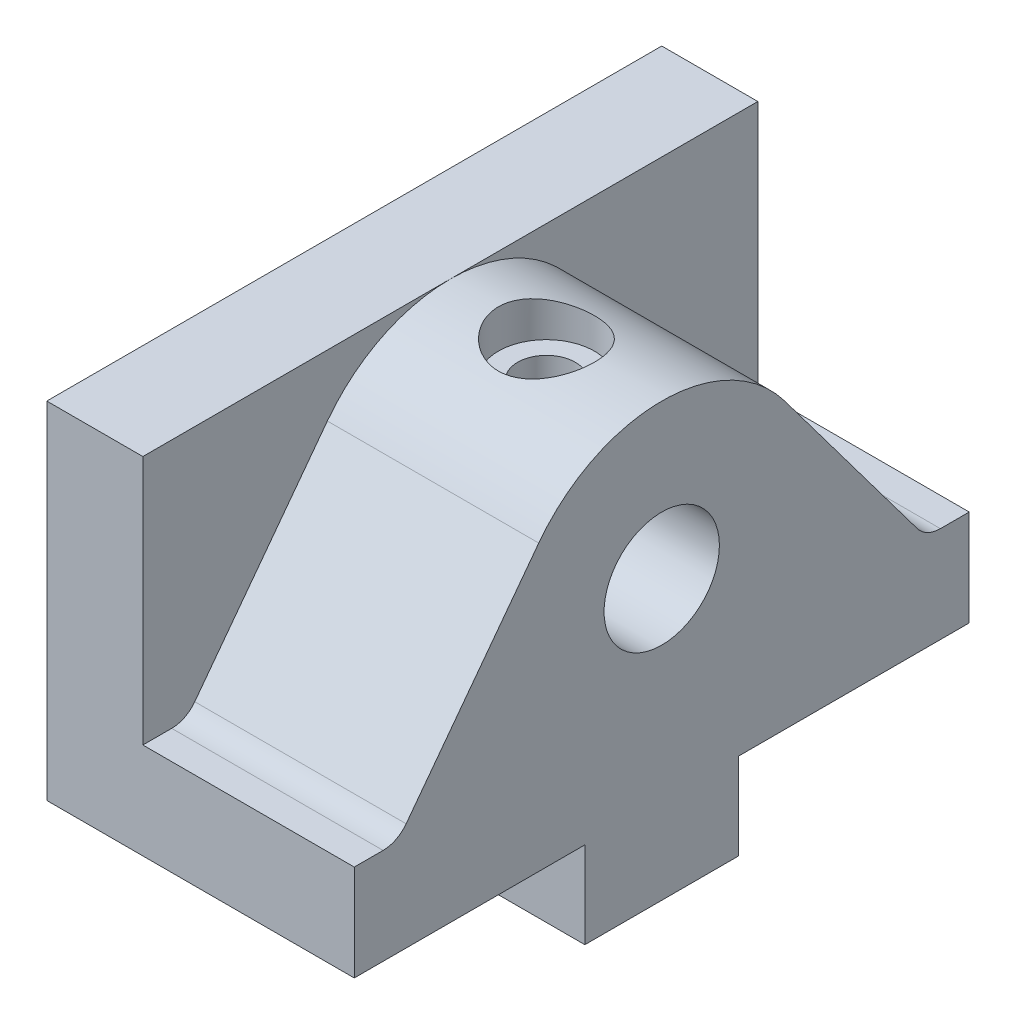
ISO-10303-21;
HEADER;
FILE_DESCRIPTION(('STEP AP214'),'2;1');
FILE_NAME('part.step','',(''),(''),'','','');
FILE_SCHEMA(('AUTOMOTIVE_DESIGN { 1 0 10303 214 1 1 1 1 }'));
ENDSEC;
DATA;
#1=APPLICATION_CONTEXT('core data for automotive mechanical design processes');
#2=APPLICATION_PROTOCOL_DEFINITION('international standard','automotive_design',2000,#1);
#3=PRODUCT_CONTEXT('',#1,'mechanical');
#4=PRODUCT('Part','Part','',(#3));
#5=PRODUCT_RELATED_PRODUCT_CATEGORY('part','',(#4));
#6=PRODUCT_DEFINITION_FORMATION('','',#4);
#7=PRODUCT_DEFINITION_CONTEXT('part definition',#1,'design');
#8=PRODUCT_DEFINITION('design','',#6,#7);
#9=PRODUCT_DEFINITION_SHAPE('','',#8);
#10=(LENGTH_UNIT() NAMED_UNIT(*) SI_UNIT(.MILLI.,.METRE.));
#11=(NAMED_UNIT(*) PLANE_ANGLE_UNIT() SI_UNIT($,.RADIAN.));
#12=(NAMED_UNIT(*) SI_UNIT($,.STERADIAN.) SOLID_ANGLE_UNIT());
#13=UNCERTAINTY_MEASURE_WITH_UNIT(LENGTH_MEASURE(1.E-05),#10,'distance_accuracy_value','');
#14=(GEOMETRIC_REPRESENTATION_CONTEXT(3) GLOBAL_UNCERTAINTY_ASSIGNED_CONTEXT((#13)) GLOBAL_UNIT_ASSIGNED_CONTEXT((#10,
#11,#12)) REPRESENTATION_CONTEXT('',''));
#15=CARTESIAN_POINT('',(0.,0.,0.));
#16=DIRECTION('',(0.,0.,1.));
#17=DIRECTION('',(1.,0.,0.));
#18=AXIS2_PLACEMENT_3D('',#15,#16,#17);
#19=CARTESIAN_POINT('',(10.,0.,0.));
#20=DIRECTION('',(-1.,0.,0.));
#21=DIRECTION('',(0.,0.,1.));
#22=AXIS2_PLACEMENT_3D('',#19,#20,#21);
#23=PLANE('',#22);
#24=DIRECTION('',(0.,-0.8,-0.600000000000001));
#25=VECTOR('',#24,1.);
#26=CARTESIAN_POINT('',(10.,20.04,-26.72));
#27=LINE('',#26,#25);
#28=CARTESIAN_POINT('',(10.,38.6,-12.8));
#29=VERTEX_POINT('',#28);
#30=CARTESIAN_POINT('',(10.,20.2,-26.6));
#31=VERTEX_POINT('',#30);
#32=EDGE_CURVE('E299',#29,#31,#27,.T.);
#33=ORIENTED_EDGE('',*,*,#32,.T.);
#34=CARTESIAN_POINT('',(10.,22.,-29.));
#35=DIRECTION('',(-1.,0.,0.));
#36=DIRECTION('',(0.,0.,1.));
#37=AXIS2_PLACEMENT_3D('',#34,#35,#36);
#38=CIRCLE('',#37,3.);
#39=CARTESIAN_POINT('',(10.,19.,-29.));
#40=VERTEX_POINT('',#39);
#41=EDGE_CURVE('E62',#31,#40,#38,.F.);
#42=ORIENTED_EDGE('',*,*,#41,.T.);
#43=DIRECTION('',(0.,0.,-1.));
#44=VECTOR('',#43,1.);
#45=CARTESIAN_POINT('',(10.,19.,0.));
#46=LINE('',#45,#44);
#47=CARTESIAN_POINT('',(10.,19.,-32.));
#48=VERTEX_POINT('',#47);
#49=EDGE_CURVE('E305',#40,#48,#46,.T.);
#50=ORIENTED_EDGE('',*,*,#49,.T.);
#51=DIRECTION('',(0.,-1.,0.));
#52=VECTOR('',#51,1.);
#53=CARTESIAN_POINT('',(10.,45.,-32.));
#54=LINE('',#53,#52);
#55=CARTESIAN_POINT('',(10.,45.,-32.));
#56=VERTEX_POINT('',#55);
#57=EDGE_CURVE('E336',#56,#48,#54,.T.);
#58=ORIENTED_EDGE('',*,*,#57,.F.);
#59=DIRECTION('',(0.,0.,-1.));
#60=VECTOR('',#59,1.);
#61=CARTESIAN_POINT('',(10.,45.,32.));
#62=LINE('',#61,#60);
#63=CARTESIAN_POINT('',(10.,45.,0.));
#64=VERTEX_POINT('',#63);
#65=EDGE_CURVE('E337',#64,#56,#62,.T.);
#66=ORIENTED_EDGE('',*,*,#65,.F.);
#67=CARTESIAN_POINT('',(10.,29.,0.));
#68=DIRECTION('',(1.,0.,0.));
#69=DIRECTION('',(0.,0.,-1.));
#70=AXIS2_PLACEMENT_3D('',#67,#68,#69);
#71=CIRCLE('',#70,16.);
#72=EDGE_CURVE('E233',#64,#29,#71,.F.);
#73=ORIENTED_EDGE('',*,*,#72,.T.);
#74=EDGE_LOOP('',(#33,#42,#50,#58,#66,#73));
#75=FACE_BOUND('',#74,.T.);
#76=ADVANCED_FACE('F39',(#75),#23,.F.);
#77=CARTESIAN_POINT('',(10.,45.,32.));
#78=DIRECTION('',(0.,1.,0.));
#79=DIRECTION('',(0.,0.,1.));
#80=AXIS2_PLACEMENT_3D('',#77,#78,#79);
#81=PLANE('',#80);
#82=DIRECTION('',(0.,0.,-1.));
#83=VECTOR('',#82,1.);
#84=CARTESIAN_POINT('',(0.,45.,32.));
#85=LINE('',#84,#83);
#86=CARTESIAN_POINT('',(0.,45.,32.));
#87=VERTEX_POINT('',#86);
#88=CARTESIAN_POINT('',(0.,45.,-32.));
#89=VERTEX_POINT('',#88);
#90=EDGE_CURVE('E331',#87,#89,#85,.T.);
#91=ORIENTED_EDGE('',*,*,#90,.F.);
#92=DIRECTION('',(-1.,0.,0.));
#93=VECTOR('',#92,1.);
#94=CARTESIAN_POINT('',(10.,45.,32.));
#95=LINE('',#94,#93);
#96=CARTESIAN_POINT('',(10.,45.,32.));
#97=VERTEX_POINT('',#96);
#98=EDGE_CURVE('E375',#97,#87,#95,.T.);
#99=ORIENTED_EDGE('',*,*,#98,.F.);
#100=EDGE_CURVE('E332',#97,#64,#62,.T.);
#101=ORIENTED_EDGE('',*,*,#100,.T.);
#102=ORIENTED_EDGE('',*,*,#65,.T.);
#103=DIRECTION('',(-1.,0.,0.));
#104=VECTOR('',#103,1.);
#105=CARTESIAN_POINT('',(10.,45.,-32.));
#106=LINE('',#105,#104);
#107=EDGE_CURVE('E234',#56,#89,#106,.T.);
#108=ORIENTED_EDGE('',*,*,#107,.T.);
#109=EDGE_LOOP('',(#91,#99,#101,#102,#108));
#110=FACE_BOUND('',#109,.T.);
#111=ADVANCED_FACE('F258',(#110),#81,.T.);
#112=CARTESIAN_POINT('',(10.,8.99999999999999,32.));
#113=DIRECTION('',(0.,0.,1.));
#114=DIRECTION('',(0.,-1.,0.));
#115=AXIS2_PLACEMENT_3D('',#112,#113,#114);
#116=PLANE('',#115);
#117=DIRECTION('',(0.,1.,0.));
#118=VECTOR('',#117,1.);
#119=CARTESIAN_POINT('',(0.,8.99999999999999,32.));
#120=LINE('',#119,#118);
#121=CARTESIAN_POINT('',(0.,8.99999999999999,32.));
#122=VERTEX_POINT('',#121);
#123=EDGE_CURVE('E371',#122,#87,#120,.T.);
#124=ORIENTED_EDGE('',*,*,#123,.F.);
#125=DIRECTION('',(-1.,0.,0.));
#126=VECTOR('',#125,1.);
#127=CARTESIAN_POINT('',(10.,8.99999999999999,32.));
#128=LINE('',#127,#126);
#129=CARTESIAN_POINT('',(32.,8.99999999999999,32.));
#130=VERTEX_POINT('',#129);
#131=EDGE_CURVE('E378',#130,#122,#128,.T.);
#132=ORIENTED_EDGE('',*,*,#131,.F.);
#133=DIRECTION('',(0.,-1.,0.));
#134=VECTOR('',#133,1.);
#135=CARTESIAN_POINT('',(32.,0.,32.));
#136=LINE('',#135,#134);
#137=CARTESIAN_POINT('',(32.,19.,32.));
#138=VERTEX_POINT('',#137);
#139=EDGE_CURVE('E449',#138,#130,#136,.T.);
#140=ORIENTED_EDGE('',*,*,#139,.F.);
#141=DIRECTION('',(-1.,0.,0.));
#142=VECTOR('',#141,1.);
#143=CARTESIAN_POINT('',(32.,19.,32.));
#144=LINE('',#143,#142);
#145=CARTESIAN_POINT('',(10.,19.,32.));
#146=VERTEX_POINT('',#145);
#147=EDGE_CURVE('E324',#138,#146,#144,.T.);
#148=ORIENTED_EDGE('',*,*,#147,.T.);
#149=DIRECTION('',(0.,1.,0.));
#150=VECTOR('',#149,1.);
#151=CARTESIAN_POINT('',(10.,8.99999999999999,32.));
#152=LINE('',#151,#150);
#153=EDGE_CURVE('E341',#146,#97,#152,.T.);
#154=ORIENTED_EDGE('',*,*,#153,.T.);
#155=ORIENTED_EDGE('',*,*,#98,.T.);
#156=EDGE_LOOP('',(#124,#132,#140,#148,#154,#155));
#157=FACE_BOUND('',#156,.T.);
#158=ADVANCED_FACE('F254',(#157),#116,.T.);
#159=CARTESIAN_POINT('',(10.,9.,8.));
#160=DIRECTION('',(0.,-1.,0.));
#161=DIRECTION('',(0.,0.,-1.));
#162=AXIS2_PLACEMENT_3D('',#159,#160,#161);
#163=PLANE('',#162);
#164=DIRECTION('',(0.,0.,1.));
#165=VECTOR('',#164,1.);
#166=CARTESIAN_POINT('',(0.,9.,8.));
#167=LINE('',#166,#165);
#168=CARTESIAN_POINT('',(0.,9.,8.));
#169=VERTEX_POINT('',#168);
#170=EDGE_CURVE('E367',#169,#122,#167,.T.);
#171=ORIENTED_EDGE('',*,*,#170,.F.);
#172=DIRECTION('',(-1.,0.,0.));
#173=VECTOR('',#172,1.);
#174=CARTESIAN_POINT('',(10.,9.,8.));
#175=LINE('',#174,#173);
#176=CARTESIAN_POINT('',(32.,9.,8.));
#177=VERTEX_POINT('',#176);
#178=EDGE_CURVE('E381',#177,#169,#175,.T.);
#179=ORIENTED_EDGE('',*,*,#178,.F.);
#180=DIRECTION('',(0.,0.,-1.));
#181=VECTOR('',#180,1.);
#182=CARTESIAN_POINT('',(32.,9.,0.));
#183=LINE('',#182,#181);
#184=EDGE_CURVE('E445',#130,#177,#183,.T.);
#185=ORIENTED_EDGE('',*,*,#184,.F.);
#186=ORIENTED_EDGE('',*,*,#131,.T.);
#187=EDGE_LOOP('',(#171,#179,#185,#186));
#188=FACE_BOUND('',#187,.T.);
#189=ADVANCED_FACE('F257',(#188),#163,.T.);
#190=CARTESIAN_POINT('',(10.,0.,8.));
#191=DIRECTION('',(0.,0.,1.));
#192=DIRECTION('',(0.,-1.,0.));
#193=AXIS2_PLACEMENT_3D('',#190,#191,#192);
#194=PLANE('',#193);
#195=DIRECTION('',(0.,1.,0.));
#196=VECTOR('',#195,1.);
#197=CARTESIAN_POINT('',(0.,0.,8.));
#198=LINE('',#197,#196);
#199=CARTESIAN_POINT('',(0.,0.,8.));
#200=VERTEX_POINT('',#199);
#201=EDGE_CURVE('E363',#200,#169,#198,.T.);
#202=ORIENTED_EDGE('',*,*,#201,.F.);
#203=DIRECTION('',(-1.,0.,0.));
#204=VECTOR('',#203,1.);
#205=CARTESIAN_POINT('',(10.,0.,8.));
#206=LINE('',#205,#204);
#207=CARTESIAN_POINT('',(32.,0.,8.));
#208=VERTEX_POINT('',#207);
#209=EDGE_CURVE('E384',#208,#200,#206,.T.);
#210=ORIENTED_EDGE('',*,*,#209,.F.);
#211=DIRECTION('',(0.,-1.,0.));
#212=VECTOR('',#211,1.);
#213=CARTESIAN_POINT('',(32.,0.,8.));
#214=LINE('',#213,#212);
#215=EDGE_CURVE('E441',#177,#208,#214,.T.);
#216=ORIENTED_EDGE('',*,*,#215,.F.);
#217=ORIENTED_EDGE('',*,*,#178,.T.);
#218=EDGE_LOOP('',(#202,#210,#216,#217));
#219=FACE_BOUND('',#218,.T.);
#220=ADVANCED_FACE('F262',(#219),#194,.T.);
#221=CARTESIAN_POINT('',(10.,0.,-8.));
#222=DIRECTION('',(0.,-1.,0.));
#223=DIRECTION('',(0.,0.,-1.));
#224=AXIS2_PLACEMENT_3D('',#221,#222,#223);
#225=PLANE('',#224);
#226=CARTESIAN_POINT('',(8.,0.,0.));
#227=DIRECTION('',(0.,-1.,0.));
#228=DIRECTION('',(0.,0.,-1.));
#229=AXIS2_PLACEMENT_3D('',#226,#227,#228);
#230=CIRCLE('',#229,1.15);
#231=CARTESIAN_POINT('',(8.,0.,-1.15));
#232=VERTEX_POINT('',#231);
#233=EDGE_CURVE('E170',#232,#232,#230,.T.);
#234=ORIENTED_EDGE('',*,*,#233,.F.);
#235=EDGE_LOOP('',(#234));
#236=FACE_BOUND('',#235,.T.);
#237=CARTESIAN_POINT('',(24.,0.,0.));
#238=DIRECTION('',(0.,-1.,0.));
#239=DIRECTION('',(0.,0.,-1.));
#240=AXIS2_PLACEMENT_3D('',#237,#238,#239);
#241=CIRCLE('',#240,1.15);
#242=CARTESIAN_POINT('',(24.,0.,-1.15));
#243=VERTEX_POINT('',#242);
#244=EDGE_CURVE('E169',#243,#243,#241,.T.);
#245=ORIENTED_EDGE('',*,*,#244,.F.);
#246=EDGE_LOOP('',(#245));
#247=FACE_BOUND('',#246,.T.);
#248=DIRECTION('',(0.,0.,1.));
#249=VECTOR('',#248,1.);
#250=CARTESIAN_POINT('',(0.,0.,-8.));
#251=LINE('',#250,#249);
#252=CARTESIAN_POINT('',(0.,0.,-8.));
#253=VERTEX_POINT('',#252);
#254=EDGE_CURVE('E359',#253,#200,#251,.T.);
#255=ORIENTED_EDGE('',*,*,#254,.F.);
#256=DIRECTION('',(-1.,0.,0.));
#257=VECTOR('',#256,1.);
#258=CARTESIAN_POINT('',(10.,0.,-8.));
#259=LINE('',#258,#257);
#260=CARTESIAN_POINT('',(32.,0.,-8.));
#261=VERTEX_POINT('',#260);
#262=EDGE_CURVE('E387',#261,#253,#259,.T.);
#263=ORIENTED_EDGE('',*,*,#262,.F.);
#264=DIRECTION('',(0.,0.,-1.));
#265=VECTOR('',#264,1.);
#266=CARTESIAN_POINT('',(32.,0.,0.));
#267=LINE('',#266,#265);
#268=EDGE_CURVE('E437',#208,#261,#267,.T.);
#269=ORIENTED_EDGE('',*,*,#268,.F.);
#270=ORIENTED_EDGE('',*,*,#209,.T.);
#271=EDGE_LOOP('',(#255,#263,#269,#270));
#272=FACE_BOUND('',#271,.T.);
#273=ADVANCED_FACE('F266',(#236,#247,#272),#225,.T.);
#274=CARTESIAN_POINT('',(10.,9.,-8.));
#275=DIRECTION('',(0.,0.,-1.));
#276=DIRECTION('',(0.,1.,0.));
#277=AXIS2_PLACEMENT_3D('',#274,#275,#276);
#278=PLANE('',#277);
#279=DIRECTION('',(0.,-1.,0.));
#280=VECTOR('',#279,1.);
#281=CARTESIAN_POINT('',(0.,9.,-8.));
#282=LINE('',#281,#280);
#283=CARTESIAN_POINT('',(0.,9.,-8.));
#284=VERTEX_POINT('',#283);
#285=EDGE_CURVE('E355',#284,#253,#282,.T.);
#286=ORIENTED_EDGE('',*,*,#285,.F.);
#287=DIRECTION('',(-1.,0.,0.));
#288=VECTOR('',#287,1.);
#289=CARTESIAN_POINT('',(10.,9.,-8.));
#290=LINE('',#289,#288);
#291=CARTESIAN_POINT('',(32.,9.,-8.));
#292=VERTEX_POINT('',#291);
#293=EDGE_CURVE('E390',#292,#284,#290,.T.);
#294=ORIENTED_EDGE('',*,*,#293,.F.);
#295=DIRECTION('',(0.,1.,0.));
#296=VECTOR('',#295,1.);
#297=CARTESIAN_POINT('',(32.,0.,-8.));
#298=LINE('',#297,#296);
#299=EDGE_CURVE('E433',#261,#292,#298,.T.);
#300=ORIENTED_EDGE('',*,*,#299,.F.);
#301=ORIENTED_EDGE('',*,*,#262,.T.);
#302=EDGE_LOOP('',(#286,#294,#300,#301));
#303=FACE_BOUND('',#302,.T.);
#304=ADVANCED_FACE('F270',(#303),#278,.T.);
#305=CARTESIAN_POINT('',(10.,8.99999999999999,-32.));
#306=DIRECTION('',(0.,-1.,0.));
#307=DIRECTION('',(0.,0.,-1.));
#308=AXIS2_PLACEMENT_3D('',#305,#306,#307);
#309=PLANE('',#308);
#310=DIRECTION('',(0.,0.,1.));
#311=VECTOR('',#310,1.);
#312=CARTESIAN_POINT('',(0.,8.99999999999999,-32.));
#313=LINE('',#312,#311);
#314=CARTESIAN_POINT('',(0.,8.99999999999999,-32.));
#315=VERTEX_POINT('',#314);
#316=EDGE_CURVE('E351',#315,#284,#313,.T.);
#317=ORIENTED_EDGE('',*,*,#316,.F.);
#318=DIRECTION('',(-1.,0.,0.));
#319=VECTOR('',#318,1.);
#320=CARTESIAN_POINT('',(10.,8.99999999999999,-32.));
#321=LINE('',#320,#319);
#322=CARTESIAN_POINT('',(32.,8.99999999999999,-32.));
#323=VERTEX_POINT('',#322);
#324=EDGE_CURVE('E392',#323,#315,#321,.T.);
#325=ORIENTED_EDGE('',*,*,#324,.F.);
#326=DIRECTION('',(0.,0.,-1.));
#327=VECTOR('',#326,1.);
#328=CARTESIAN_POINT('',(32.,9.,0.));
#329=LINE('',#328,#327);
#330=EDGE_CURVE('E429',#292,#323,#329,.T.);
#331=ORIENTED_EDGE('',*,*,#330,.F.);
#332=ORIENTED_EDGE('',*,*,#293,.T.);
#333=EDGE_LOOP('',(#317,#325,#331,#332));
#334=FACE_BOUND('',#333,.T.);
#335=ADVANCED_FACE('F274',(#334),#309,.T.);
#336=CARTESIAN_POINT('',(10.,45.,-32.));
#337=DIRECTION('',(0.,0.,-1.));
#338=DIRECTION('',(0.,1.,0.));
#339=AXIS2_PLACEMENT_3D('',#336,#337,#338);
#340=PLANE('',#339);
#341=DIRECTION('',(0.,-1.,0.));
#342=VECTOR('',#341,1.);
#343=CARTESIAN_POINT('',(0.,45.,-32.));
#344=LINE('',#343,#342);
#345=EDGE_CURVE('E347',#89,#315,#344,.T.);
#346=ORIENTED_EDGE('',*,*,#345,.F.);
#347=ORIENTED_EDGE('',*,*,#107,.F.);
#348=ORIENTED_EDGE('',*,*,#57,.T.);
#349=DIRECTION('',(-1.,0.,0.));
#350=VECTOR('',#349,1.);
#351=CARTESIAN_POINT('',(32.,19.,-32.));
#352=LINE('',#351,#350);
#353=CARTESIAN_POINT('',(32.,19.,-32.));
#354=VERTEX_POINT('',#353);
#355=EDGE_CURVE('E319',#354,#48,#352,.T.);
#356=ORIENTED_EDGE('',*,*,#355,.F.);
#357=DIRECTION('',(0.,1.,0.));
#358=VECTOR('',#357,1.);
#359=CARTESIAN_POINT('',(32.,0.,-32.));
#360=LINE('',#359,#358);
#361=EDGE_CURVE('E425',#323,#354,#360,.T.);
#362=ORIENTED_EDGE('',*,*,#361,.F.);
#363=ORIENTED_EDGE('',*,*,#324,.T.);
#364=EDGE_LOOP('',(#346,#347,#348,#356,#362,#363));
#365=FACE_BOUND('',#364,.T.);
#366=ADVANCED_FACE('F249',(#365),#340,.T.);
#367=DIRECTION('',(0.,0.,-1.));
#368=VECTOR('',#367,1.);
#369=CARTESIAN_POINT('',(10.,19.,0.));
#370=LINE('',#369,#368);
#371=CARTESIAN_POINT('',(10.,19.,29.));
#372=VERTEX_POINT('',#371);
#373=EDGE_CURVE('E312',#146,#372,#370,.T.);
#374=ORIENTED_EDGE('',*,*,#373,.T.);
#375=CARTESIAN_POINT('',(10.,22.,29.));
#376=DIRECTION('',(-1.,0.,0.));
#377=DIRECTION('',(0.,0.,1.));
#378=AXIS2_PLACEMENT_3D('',#375,#376,#377);
#379=CIRCLE('',#378,3.);
#380=CARTESIAN_POINT('',(10.,20.2,26.6));
#381=VERTEX_POINT('',#380);
#382=EDGE_CURVE('E464',#372,#381,#379,.F.);
#383=ORIENTED_EDGE('',*,*,#382,.T.);
#384=DIRECTION('',(0.,0.8,-0.600000000000001));
#385=VECTOR('',#384,1.);
#386=CARTESIAN_POINT('',(10.,20.04,26.72));
#387=LINE('',#386,#385);
#388=CARTESIAN_POINT('',(10.,38.6,12.8));
#389=VERTEX_POINT('',#388);
#390=EDGE_CURVE('E413',#381,#389,#387,.T.);
#391=ORIENTED_EDGE('',*,*,#390,.T.);
#392=EDGE_CURVE('E411',#389,#64,#71,.F.);
#393=ORIENTED_EDGE('',*,*,#392,.T.);
#394=ORIENTED_EDGE('',*,*,#100,.F.);
#395=ORIENTED_EDGE('',*,*,#153,.F.);
#396=EDGE_LOOP('',(#374,#383,#391,#393,#394,#395));
#397=FACE_BOUND('',#396,.T.);
#398=ADVANCED_FACE('F246',(#397),#23,.F.);
#399=CARTESIAN_POINT('',(0.,0.,0.));
#400=DIRECTION('',(-1.,0.,0.));
#401=DIRECTION('',(0.,0.,1.));
#402=AXIS2_PLACEMENT_3D('',#399,#400,#401);
#403=PLANE('',#402);
#404=ORIENTED_EDGE('',*,*,#90,.T.);
#405=ORIENTED_EDGE('',*,*,#345,.T.);
#406=ORIENTED_EDGE('',*,*,#316,.T.);
#407=ORIENTED_EDGE('',*,*,#285,.T.);
#408=ORIENTED_EDGE('',*,*,#254,.T.);
#409=ORIENTED_EDGE('',*,*,#201,.T.);
#410=ORIENTED_EDGE('',*,*,#170,.T.);
#411=ORIENTED_EDGE('',*,*,#123,.T.);
#412=EDGE_LOOP('',(#404,#405,#406,#407,#408,#409,#410,#411));
#413=FACE_BOUND('',#412,.T.);
#414=ADVANCED_FACE('F243',(#413),#403,.T.);
#415=CARTESIAN_POINT('',(32.,29.,0.));
#416=DIRECTION('',(-1.,0.,0.));
#417=DIRECTION('',(0.,0.,1.));
#418=AXIS2_PLACEMENT_3D('',#415,#416,#417);
#419=CYLINDRICAL_SURFACE('',#418,16.);
#420=CARTESIAN_POINT('',(20.,44.1986841535707,5.));
#421=CARTESIAN_POINT('',(20.2733881444516,44.1986858388479,4.99999815120853));
#422=CARTESIAN_POINT('',(20.5467950748166,44.206141260301,4.97750155166156));
#423=CARTESIAN_POINT('',(21.0855766435074,44.2350255598558,4.88836701605129));
#424=CARTESIAN_POINT('',(21.3509490909276,44.2564582140988,4.82171715130012));
#425=CARTESIAN_POINT('',(21.865779607729,44.3106375534649,4.64679152894283));
#426=CARTESIAN_POINT('',(22.115264932423,44.3433642077798,4.5385894294672));
#427=CARTESIAN_POINT('',(22.5926107834558,44.4164162487404,4.28387656692615));
#428=CARTESIAN_POINT('',(22.8204674798404,44.4567429774317,4.13735903622524));
#429=CARTESIAN_POINT('',(23.255915469974,44.5420051067468,3.80478428248921));
#430=CARTESIAN_POINT('',(23.462654437744,44.5870449353917,3.6176375988816));
#431=CARTESIAN_POINT('',(23.8423840528367,44.6757698344129,3.21144818582197));
#432=CARTESIAN_POINT('',(24.0153699877794,44.7194547149049,2.99240101007426));
#433=CARTESIAN_POINT('',(24.326444252045,44.8017421356033,2.52250364997345));
#434=CARTESIAN_POINT('',(24.4636548153258,44.8402073825112,2.27104622608038));
#435=CARTESIAN_POINT('',(24.6935041994222,44.9065020733207,1.74721693141361));
#436=CARTESIAN_POINT('',(24.7861534965983,44.9343340167968,1.47484999394821));
#437=CARTESIAN_POINT('',(24.9214045123883,44.9754870328345,0.925857427864395));
#438=CARTESIAN_POINT('',(24.9654629991514,44.9892295593656,0.649622861872867));
#439=CARTESIAN_POINT('',(25.0068973857501,45.0021438350406,0.0933632559380805));
#440=CARTESIAN_POINT('',(25.0042838974353,45.0013188964028,-0.186660907892343));
#441=CARTESIAN_POINT('',(24.9534068336562,44.9854846453012,-0.732297921418923));
#442=CARTESIAN_POINT('',(24.906722465948,44.9709660388855,-0.998074537256128));
#443=CARTESIAN_POINT('',(24.7716200398279,44.929979302435,-1.51781225339112));
#444=CARTESIAN_POINT('',(24.6831992596535,44.9035103930884,-1.77177258192494));
#445=CARTESIAN_POINT('',(24.4661192437008,44.8409383891782,-2.26431241261896));
#446=CARTESIAN_POINT('',(24.336980765749,44.8047213446668,-2.50266562249071));
#447=CARTESIAN_POINT('',(24.0425156011806,44.7264689181539,-2.95481004460872));
#448=CARTESIAN_POINT('',(23.8771797634445,44.6844320658262,-3.16859502483763));
#449=CARTESIAN_POINT('',(23.5069054607991,44.5969468293413,-3.57495079381313));
#450=CARTESIAN_POINT('',(23.3006037246516,44.5514292793937,-3.76626619636764));
#451=CARTESIAN_POINT('',(22.8584195926857,44.4636246177862,-4.11195897039057));
#452=CARTESIAN_POINT('',(22.6225337176386,44.4213378870279,-4.26633199104754));
#453=CARTESIAN_POINT('',(22.1243301246097,44.3444338653158,-4.53521860076337));
#454=CARTESIAN_POINT('',(21.8617463640361,44.3099076117639,-4.64926722799054));
#455=CARTESIAN_POINT('',(21.319762032632,44.253501811154,-4.83113383782182));
#456=CARTESIAN_POINT('',(21.0403675432225,44.2316177207004,-4.89896843060006));
#457=CARTESIAN_POINT('',(20.4847201896914,44.2039825362816,-4.98405940745619));
#458=CARTESIAN_POINT('',(20.2087920150595,44.1976186557502,-5.00323817415588));
#459=CARTESIAN_POINT('',(19.6576410340194,44.200043098397,-4.99586977992483));
#460=CARTESIAN_POINT('',(19.3824181252013,44.2088290802926,-4.96932968445626));
#461=CARTESIAN_POINT('',(18.8487668133903,44.2399582993566,-4.87299494052764));
#462=CARTESIAN_POINT('',(18.5900829037032,44.2619021640804,-4.80447324642202));
#463=CARTESIAN_POINT('',(18.0879128320167,44.3164514932552,-4.62761494644059));
#464=CARTESIAN_POINT('',(17.8444291563155,44.3490586964925,-4.51927184684604));
#465=CARTESIAN_POINT('',(17.3718435609128,44.4224215861294,-4.26230042623513));
#466=CARTESIAN_POINT('',(17.1433543376288,44.4633841395902,-4.11260589954233));
#467=CARTESIAN_POINT('',(16.7140386145524,44.5484139589123,-3.77842563471921));
#468=CARTESIAN_POINT('',(16.5132193242987,44.5924820294279,-3.59393085876312));
#469=CARTESIAN_POINT('',(16.1363585363487,44.6809675025074,-3.18629179101443));
#470=CARTESIAN_POINT('',(15.9616888554405,44.7253236914272,-2.96186259915409));
#471=CARTESIAN_POINT('',(15.652435826715,44.8075623937471,-2.48580618260559));
#472=CARTESIAN_POINT('',(15.5178506427559,44.8454452036378,-2.23418020443449));
#473=CARTESIAN_POINT('',(15.2938777501133,44.9102524771405,-1.71242209332733));
#474=CARTESIAN_POINT('',(15.2041628486253,44.937255982448,-1.44244073713503));
#475=CARTESIAN_POINT('',(15.0717098456412,44.9776097059431,-0.890229016225558));
#476=CARTESIAN_POINT('',(15.028957043666,44.9909641965712,-0.608002513361419));
#477=CARTESIAN_POINT('',(14.9928359930015,45.0022321361783,-0.0519397465956098));
#478=CARTESIAN_POINT('',(14.9974861993169,45.0007651762951,0.221756767786048));
#479=CARTESIAN_POINT('',(15.0512472441948,44.9840391232424,0.764292887693025));
#480=CARTESIAN_POINT('',(15.100355183968,44.9687809293064,1.0331328087184));
#481=CARTESIAN_POINT('',(15.2403760368889,44.9263828337901,1.55502047392302));
#482=CARTESIAN_POINT('',(15.3307584313808,44.899393918402,1.80822367379742));
#483=CARTESIAN_POINT('',(15.5502833088346,44.8363178235242,2.29599370200086));
#484=CARTESIAN_POINT('',(15.6794324398962,44.8002290836774,2.53055732509979));
#485=CARTESIAN_POINT('',(15.9778910333752,44.7211958753111,2.98304677987682));
#486=CARTESIAN_POINT('',(16.148414089846,44.6780603899479,3.20013842820512));
#487=CARTESIAN_POINT('',(16.5226395577837,44.590349461973,3.60328316560459));
#488=CARTESIAN_POINT('',(16.7263518965944,44.5457735917315,3.78932693404398));
#489=CARTESIAN_POINT('',(17.1692628793298,44.4584757027472,4.13131463642454));
#490=CARTESIAN_POINT('',(17.4094136123294,44.4158640332118,4.28605711968616));
#491=CARTESIAN_POINT('',(17.9135924809501,44.3392050100618,4.55281882984169));
#492=CARTESIAN_POINT('',(18.1776109057873,44.3051541945183,4.66485533612217));
#493=CARTESIAN_POINT('',(18.6988904692749,44.2522624175552,4.83484721745085));
#494=CARTESIAN_POINT('',(18.9548101897559,44.2323726005923,4.89659759350261));
#495=CARTESIAN_POINT('',(19.4738153283157,44.2055842579893,4.97916983261894));
#496=CARTESIAN_POINT('',(19.7368989647822,44.1986825317074,5.00000177922473));
#497=CARTESIAN_POINT('',(20.,44.1986841535707,5.));
#498=B_SPLINE_CURVE_WITH_KNOTS('',3,(#420,#421,#422,#423,#424,#425,#426,#427,#428,#429,#430,
#431,#432,#433,#434,#435,#436,#437,#438,#439,#440,#441,#442,#443,#444,#445,#446,#447,#448,#449,
#450,#451,#452,#453,#454,#455,#456,#457,#458,#459,#460,#461,#462,#463,#464,#465,#466,#467,#468,
#469,#470,#471,#472,#473,#474,#475,#476,#477,#478,#479,#480,#481,#482,#483,#484,#485,#486,#487,
#488,#489,#490,#491,#492,#493,#494,#495,#496,#497),.UNSPECIFIED.,.T.,.F.,(4,2,2,2,2,2,2,2,2,2,2,
2,2,2,2,2,2,2,2,2,2,2,2,2,2,2,2,2,2,2,2,2,2,2,2,2,2,2,4),(0.,0.819192550193962,1.63860650823894,
2.45657457647432,3.27468721969978,4.11828322203352,4.9619969176449,5.82479287854932,
6.68738589671687,7.52334891342134,8.35912185887097,9.16603931879001,9.97300940760372,
10.7898561843363,11.6069097085275,12.4580135574933,13.309217594151,14.1699388374229,
15.0303505582074,15.8561973316147,16.6819164888608,17.4837588818718,18.2857320902257,
19.1107045324817,19.9358915205725,20.7952775125577,21.6546241327807,22.5076095717372,
23.3603279257207,24.1775520976783,24.9947229877895,25.8016738606876,26.6087631965633,
27.4432277243059,28.2779423109849,29.1403118201788,30.002332032282,30.7908941750129,
31.5792619677388),.UNSPECIFIED.);
#499=CARTESIAN_POINT('',(20.,44.1986841535707,5.));
#500=VERTEX_POINT('',#499);
#501=EDGE_CURVE('E223',#500,#500,#498,.T.);
#502=ORIENTED_EDGE('',*,*,#501,.F.);
#503=EDGE_LOOP('',(#502));
#504=FACE_BOUND('',#503,.T.);
#505=ORIENTED_EDGE('',*,*,#392,.F.);
#506=DIRECTION('',(-1.,0.,0.));
#507=VECTOR('',#506,1.);
#508=CARTESIAN_POINT('',(32.,38.6,12.8));
#509=LINE('',#508,#507);
#510=CARTESIAN_POINT('',(32.,38.6,12.8));
#511=VERTEX_POINT('',#510);
#512=EDGE_CURVE('E327',#511,#389,#509,.T.);
#513=ORIENTED_EDGE('',*,*,#512,.F.);
#514=CARTESIAN_POINT('',(32.,29.,0.));
#515=DIRECTION('',(1.,0.,0.));
#516=DIRECTION('',(0.,0.,-1.));
#517=AXIS2_PLACEMENT_3D('',#514,#515,#516);
#518=CIRCLE('',#517,16.);
#519=CARTESIAN_POINT('',(32.,38.6,-12.8));
#520=VERTEX_POINT('',#519);
#521=EDGE_CURVE('E304',#511,#520,#518,.F.);
#522=ORIENTED_EDGE('',*,*,#521,.T.);
#523=DIRECTION('',(-1.,0.,0.));
#524=VECTOR('',#523,1.);
#525=CARTESIAN_POINT('',(32.,38.6,-12.8));
#526=LINE('',#525,#524);
#527=EDGE_CURVE('E316',#520,#29,#526,.T.);
#528=ORIENTED_EDGE('',*,*,#527,.T.);
#529=ORIENTED_EDGE('',*,*,#72,.F.);
#530=EDGE_LOOP('',(#505,#513,#522,#528,#529));
#531=FACE_BOUND('',#530,.T.);
#532=ADVANCED_FACE('F237',(#504,#531),#419,.T.);
#533=CARTESIAN_POINT('',(32.,20.04,26.72));
#534=DIRECTION('',(0.,0.6,0.8));
#535=DIRECTION('',(0.,-0.8,0.6));
#536=AXIS2_PLACEMENT_3D('',#533,#534,#535);
#537=PLANE('',#536);
#538=ORIENTED_EDGE('',*,*,#390,.F.);
#539=DIRECTION('',(-1.,0.,0.));
#540=VECTOR('',#539,1.);
#541=CARTESIAN_POINT('',(32.,20.2,26.6));
#542=LINE('',#541,#540);
#543=CARTESIAN_POINT('',(32.,20.2,26.6));
#544=VERTEX_POINT('',#543);
#545=EDGE_CURVE('E472',#381,#544,#542,.F.);
#546=ORIENTED_EDGE('',*,*,#545,.T.);
#547=DIRECTION('',(0.,0.8,-0.600000000000001));
#548=VECTOR('',#547,1.);
#549=CARTESIAN_POINT('',(32.,20.04,26.72));
#550=LINE('',#549,#548);
#551=EDGE_CURVE('E310',#544,#511,#550,.T.);
#552=ORIENTED_EDGE('',*,*,#551,.T.);
#553=ORIENTED_EDGE('',*,*,#512,.T.);
#554=EDGE_LOOP('',(#538,#546,#552,#553));
#555=FACE_BOUND('',#554,.T.);
#556=ADVANCED_FACE('F242',(#555),#537,.T.);
#557=CARTESIAN_POINT('',(32.,19.,0.));
#558=DIRECTION('',(0.,1.,0.));
#559=DIRECTION('',(0.,0.,1.));
#560=AXIS2_PLACEMENT_3D('',#557,#558,#559);
#561=PLANE('',#560);
#562=DIRECTION('',(0.,0.,-1.));
#563=VECTOR('',#562,1.);
#564=CARTESIAN_POINT('',(32.,19.,0.));
#565=LINE('',#564,#563);
#566=CARTESIAN_POINT('',(32.,19.,29.));
#567=VERTEX_POINT('',#566);
#568=EDGE_CURVE('E452',#138,#567,#565,.T.);
#569=ORIENTED_EDGE('',*,*,#568,.T.);
#570=DIRECTION('',(-1.,0.,0.));
#571=VECTOR('',#570,1.);
#572=CARTESIAN_POINT('',(10.,19.,29.));
#573=LINE('',#572,#571);
#574=EDGE_CURVE('E232',#567,#372,#573,.T.);
#575=ORIENTED_EDGE('',*,*,#574,.T.);
#576=ORIENTED_EDGE('',*,*,#373,.F.);
#577=ORIENTED_EDGE('',*,*,#147,.F.);
#578=EDGE_LOOP('',(#569,#575,#576,#577));
#579=FACE_BOUND('',#578,.T.);
#580=ADVANCED_FACE('F467',(#579),#561,.T.);
#581=CARTESIAN_POINT('',(32.,19.,0.));
#582=DIRECTION('',(0.,1.,0.));
#583=DIRECTION('',(0.,0.,1.));
#584=AXIS2_PLACEMENT_3D('',#581,#582,#583);
#585=PLANE('',#584);
#586=ORIENTED_EDGE('',*,*,#49,.F.);
#587=DIRECTION('',(-1.,0.,0.));
#588=VECTOR('',#587,1.);
#589=CARTESIAN_POINT('',(32.,19.,-29.));
#590=LINE('',#589,#588);
#591=CARTESIAN_POINT('',(32.,19.,-29.));
#592=VERTEX_POINT('',#591);
#593=EDGE_CURVE('E48',#40,#592,#590,.F.);
#594=ORIENTED_EDGE('',*,*,#593,.T.);
#595=DIRECTION('',(0.,0.,-1.));
#596=VECTOR('',#595,1.);
#597=CARTESIAN_POINT('',(32.,19.,0.));
#598=LINE('',#597,#596);
#599=EDGE_CURVE('E422',#592,#354,#598,.T.);
#600=ORIENTED_EDGE('',*,*,#599,.T.);
#601=ORIENTED_EDGE('',*,*,#355,.T.);
#602=EDGE_LOOP('',(#586,#594,#600,#601));
#603=FACE_BOUND('',#602,.T.);
#604=ADVANCED_FACE('F492',(#603),#585,.T.);
#605=CARTESIAN_POINT('',(32.,20.04,-26.72));
#606=DIRECTION('',(0.,0.6,-0.8));
#607=DIRECTION('',(0.,0.8,0.6));
#608=AXIS2_PLACEMENT_3D('',#605,#606,#607);
#609=PLANE('',#608);
#610=DIRECTION('',(0.,-0.8,-0.600000000000001));
#611=VECTOR('',#610,1.);
#612=CARTESIAN_POINT('',(32.,20.04,-26.72));
#613=LINE('',#612,#611);
#614=CARTESIAN_POINT('',(32.,20.2,-26.6));
#615=VERTEX_POINT('',#614);
#616=EDGE_CURVE('E320',#520,#615,#613,.T.);
#617=ORIENTED_EDGE('',*,*,#616,.T.);
#618=DIRECTION('',(-1.,0.,0.));
#619=VECTOR('',#618,1.);
#620=CARTESIAN_POINT('',(10.,20.2,-26.6));
#621=LINE('',#620,#619);
#622=EDGE_CURVE('E479',#615,#31,#621,.T.);
#623=ORIENTED_EDGE('',*,*,#622,.T.);
#624=ORIENTED_EDGE('',*,*,#32,.F.);
#625=ORIENTED_EDGE('',*,*,#527,.F.);
#626=EDGE_LOOP('',(#617,#623,#624,#625));
#627=FACE_BOUND('',#626,.T.);
#628=ADVANCED_FACE('F485',(#627),#609,.T.);
#629=CARTESIAN_POINT('',(32.,0.,0.));
#630=DIRECTION('',(1.,0.,0.));
#631=DIRECTION('',(0.,0.,-1.));
#632=AXIS2_PLACEMENT_3D('',#629,#630,#631);
#633=PLANE('',#632);
#634=CARTESIAN_POINT('',(32.,29.,0.));
#635=DIRECTION('',(1.,0.,0.));
#636=DIRECTION('',(0.,0.,-1.));
#637=AXIS2_PLACEMENT_3D('',#634,#635,#636);
#638=CIRCLE('',#637,6.);
#639=CARTESIAN_POINT('',(32.,29.,-6.));
#640=VERTEX_POINT('',#639);
#641=EDGE_CURVE('E200',#640,#640,#638,.T.);
#642=ORIENTED_EDGE('',*,*,#641,.F.);
#643=EDGE_LOOP('',(#642));
#644=FACE_BOUND('',#643,.T.);
#645=ORIENTED_EDGE('',*,*,#521,.F.);
#646=ORIENTED_EDGE('',*,*,#551,.F.);
#647=CARTESIAN_POINT('',(32.,22.,29.));
#648=DIRECTION('',(1.,0.,0.));
#649=DIRECTION('',(0.,0.,-1.));
#650=AXIS2_PLACEMENT_3D('',#647,#648,#649);
#651=CIRCLE('',#650,3.);
#652=EDGE_CURVE('E474',#544,#567,#651,.F.);
#653=ORIENTED_EDGE('',*,*,#652,.T.);
#654=ORIENTED_EDGE('',*,*,#568,.F.);
#655=ORIENTED_EDGE('',*,*,#139,.T.);
#656=ORIENTED_EDGE('',*,*,#184,.T.);
#657=ORIENTED_EDGE('',*,*,#215,.T.);
#658=ORIENTED_EDGE('',*,*,#268,.T.);
#659=ORIENTED_EDGE('',*,*,#299,.T.);
#660=ORIENTED_EDGE('',*,*,#330,.T.);
#661=ORIENTED_EDGE('',*,*,#361,.T.);
#662=ORIENTED_EDGE('',*,*,#599,.F.);
#663=CARTESIAN_POINT('',(32.,22.,-29.));
#664=DIRECTION('',(1.,0.,0.));
#665=DIRECTION('',(0.,0.,-1.));
#666=AXIS2_PLACEMENT_3D('',#663,#664,#665);
#667=CIRCLE('',#666,3.);
#668=EDGE_CURVE('E11',#592,#615,#667,.F.);
#669=ORIENTED_EDGE('',*,*,#668,.T.);
#670=ORIENTED_EDGE('',*,*,#616,.F.);
#671=EDGE_LOOP('',(#645,#646,#653,#654,#655,#656,#657,#658,#659,#660,#661,#662,#669,#670));
#672=FACE_BOUND('',#671,.T.);
#673=ADVANCED_FACE('F490',(#644,#672),#633,.T.);
#674=CARTESIAN_POINT('',(8.,29.,0.));
#675=DIRECTION('',(1.,0.,0.));
#676=DIRECTION('',(0.,0.,-1.));
#677=AXIS2_PLACEMENT_3D('',#674,#675,#676);
#678=CYLINDRICAL_SURFACE('',#677,6.);
#679=CARTESIAN_POINT('',(20.,34.1961524227066,3.));
#680=CARTESIAN_POINT('',(20.0782002332591,34.1961533815141,2.99999910875737));
#681=CARTESIAN_POINT('',(20.1564099984646,34.1979258119113,2.99693611207795));
#682=CARTESIAN_POINT('',(20.3122080751421,34.2049393165712,2.98473565374509));
#683=CARTESIAN_POINT('',(20.3897960802685,34.2101820056608,2.97559536411628));
#684=CARTESIAN_POINT('',(20.6209440142464,34.2308820055821,2.9391691225804));
#685=CARTESIAN_POINT('',(20.7727509105333,34.2513107660721,2.902878058149));
#686=CARTESIAN_POINT('',(21.0663916335235,34.3024774692754,2.80829998089522));
#687=CARTESIAN_POINT('',(21.2082738017509,34.3331605157792,2.75012989346617));
#688=CARTESIAN_POINT('',(21.4802627617008,34.4012807296697,2.61380253964662));
#689=CARTESIAN_POINT('',(21.6103689158749,34.4387182624135,2.53564419197537));
#690=CARTESIAN_POINT('',(21.8669201461477,34.5199058355984,2.35399963256537));
#691=CARTESIAN_POINT('',(21.9921782021559,34.5639218457163,2.24895611137363));
#692=CARTESIAN_POINT('',(22.2242243696895,34.651159547025,2.01976141989962));
#693=CARTESIAN_POINT('',(22.3310032682567,34.6943808324562,1.89560077655245));
#694=CARTESIAN_POINT('',(22.5301016877323,34.7786442898889,1.62146869109162));
#695=CARTESIAN_POINT('',(22.6209613659272,34.8193431875224,1.47032156718994));
#696=CARTESIAN_POINT('',(22.7754224974281,34.8905226880054,1.15247107964639));
#697=CARTESIAN_POINT('',(22.8390411532466,34.9210097369081,0.985777614653091));
#698=CARTESIAN_POINT('',(22.9325139979892,34.9664138360306,0.654134831556286));
#699=CARTESIAN_POINT('',(22.9644485796481,34.9822844059557,0.489905370480168));
#700=CARTESIAN_POINT('',(23.000498355444,35.0002275160526,0.157711887079232));
#701=CARTESIAN_POINT('',(23.0046303821323,35.0023084049244,-0.0102498138110366));
#702=CARTESIAN_POINT('',(22.9857599673652,34.9928894562274,-0.329497576667919));
#703=CARTESIAN_POINT('',(22.9650859119219,34.9825548724797,-0.480963609704589));
#704=CARTESIAN_POINT('',(22.9013575098035,34.9512273620779,-0.777941303579839));
#705=CARTESIAN_POINT('',(22.8583014884221,34.9302336378681,-0.923452517976628));
#706=CARTESIAN_POINT('',(22.7507521442304,34.8791474825337,-1.20692822064062));
#707=CARTESIAN_POINT('',(22.6859704687994,34.8489331854518,-1.34476044303001));
#708=CARTESIAN_POINT('',(22.537210343292,34.7821294400464,-1.60793023199368));
#709=CARTESIAN_POINT('',(22.4532250204903,34.7455377104437,-1.73326330217191));
#710=CARTESIAN_POINT('',(22.2593115260605,34.665331584921,-1.98052168794677));
#711=CARTESIAN_POINT('',(22.1476814893583,34.6213803174282,-2.10100497271934));
#712=CARTESIAN_POINT('',(21.9062402580911,34.5336311808584,-2.32231036115798));
#713=CARTESIAN_POINT('',(21.7764152061043,34.4898334550261,-2.42311733790258));
#714=CARTESIAN_POINT('',(21.4920178566593,34.4043208466552,-2.6085269546345));
#715=CARTESIAN_POINT('',(21.336397564354,34.3629148575067,-2.691694028528));
#716=CARTESIAN_POINT('',(21.0924369453882,34.3091519440867,-2.79542837524198));
#717=CARTESIAN_POINT('',(21.0093436895952,34.2926194649543,-2.82650797342001));
#718=CARTESIAN_POINT('',(20.8401913969656,34.2629847346327,-2.88131297532033));
#719=CARTESIAN_POINT('',(20.7541342255252,34.2498803689785,-2.90504291399185));
#720=CARTESIAN_POINT('',(20.586628379776,34.2285545598839,-2.94323927983803));
#721=CARTESIAN_POINT('',(20.5053505743622,34.2200298226321,-2.95828810706486));
#722=CARTESIAN_POINT('',(20.3415647613341,34.2067273715729,-2.98163903200842));
#723=CARTESIAN_POINT('',(20.2590574162517,34.2019477092041,-2.98994463830254));
#724=CARTESIAN_POINT('',(20.0935289931973,34.1963366286361,-2.99968663811345));
#725=CARTESIAN_POINT('',(20.0105081180563,34.1955037402621,-3.00112558946313));
#726=CARTESIAN_POINT('',(19.8447135392353,34.1978095319997,-2.99712742537402));
#727=CARTESIAN_POINT('',(19.7619398192495,34.2009479440325,-2.99169077406596));
#728=CARTESIAN_POINT('',(19.5331408639573,34.2150449301025,-2.96710135231213));
#729=CARTESIAN_POINT('',(19.3880891897367,34.230191606605,-2.9405616310018));
#730=CARTESIAN_POINT('',(19.1048690892031,34.270816663845,-2.86709067362229));
#731=CARTESIAN_POINT('',(18.9667029081698,34.2962983902876,-2.82015283383763));
#732=CARTESIAN_POINT('',(18.6937738960801,34.3560878027303,-2.70494224478442));
#733=CARTESIAN_POINT('',(18.5594650720959,34.3907496041273,-2.63578205088435));
#734=CARTESIAN_POINT('',(18.303590061634,34.4646832779242,-2.47886133231338));
#735=CARTESIAN_POINT('',(18.1820304691885,34.5039575138798,-2.3910912526382));
#736=CARTESIAN_POINT('',(17.9390643733681,34.588640051403,-2.18651145695799));
#737=CARTESIAN_POINT('',(17.8196087291,34.6341975208474,-2.067435804994));
#738=CARTESIAN_POINT('',(17.6017631047052,34.7220270231092,-1.81021349814979));
#739=CARTESIAN_POINT('',(17.5033802403245,34.7642979430822,-1.67206042712514));
#740=CARTESIAN_POINT('',(17.3282788724264,34.8422408580664,-1.37560608443379));
#741=CARTESIAN_POINT('',(17.2522006581169,34.8777092522688,-1.21686929217555));
#742=CARTESIAN_POINT('',(17.1285862756894,34.9365006466729,-0.886567094469549));
#743=CARTESIAN_POINT('',(17.081025045158,34.9598343091953,-0.715013103124006));
#744=CARTESIAN_POINT('',(17.0198943081509,34.9900252464518,-0.380939047947195));
#745=CARTESIAN_POINT('',(17.0036063644392,34.998197839307,-0.21903433565039));
#746=CARTESIAN_POINT('',(16.9974702115665,35.0012639091934,0.1053779619512));
#747=CARTESIAN_POINT('',(17.0076127468168,34.9961620347605,0.267885316317461));
#748=CARTESIAN_POINT('',(17.0522491901335,34.9740190719063,0.577613962536141));
#749=CARTESIAN_POINT('',(17.0850944376657,34.9577868644244,0.725136901247725));
#750=CARTESIAN_POINT('',(17.1719811080321,34.9157627855145,1.01233790874441));
#751=CARTESIAN_POINT('',(17.2260255705425,34.8899695431946,1.15201484923628));
#752=CARTESIAN_POINT('',(17.3561807286887,34.829778017116,1.42627001605164));
#753=CARTESIAN_POINT('',(17.4331363415363,34.7950588762329,1.56037465678412));
#754=CARTESIAN_POINT('',(17.6058754214136,34.7206436338201,1.81432469711303));
#755=CARTESIAN_POINT('',(17.7016675359887,34.6809452494399,1.93416350676913));
#756=CARTESIAN_POINT('',(17.9203847224835,34.5958597881944,2.16873884087782));
#757=CARTESIAN_POINT('',(18.0450613207736,34.5502997550452,2.28178066887875));
#758=CARTESIAN_POINT('',(18.3123783280701,34.4618864950968,2.48600225783028));
#759=CARTESIAN_POINT('',(18.4550344610311,34.4190356875087,2.57716267726705));
#760=CARTESIAN_POINT('',(18.6825317933018,34.3600477490699,2.69665559342489));
#761=CARTESIAN_POINT('',(18.7619758009824,34.3410121914846,2.73405408762355));
#762=CARTESIAN_POINT('',(18.9243532830087,34.3057278306372,2.80191257626505));
#763=CARTESIAN_POINT('',(19.007284933748,34.2894775930144,2.83237614466584));
#764=CARTESIAN_POINT('',(19.1758447323698,34.2604521586819,2.88592624586958));
#765=CARTESIAN_POINT('',(19.2614653072414,34.2476680350909,2.90903175649394));
#766=CARTESIAN_POINT('',(19.4348552553143,34.2260886962511,2.94762428051629));
#767=CARTESIAN_POINT('',(19.5226230809206,34.2172906924366,2.96311662049621));
#768=CARTESIAN_POINT('',(19.6753988177599,34.2058852801613,2.9830938122572));
#769=CARTESIAN_POINT('',(19.740094808907,34.2022444258814,2.9894274622838));
#770=CARTESIAN_POINT('',(19.8698583167997,34.1973775174469,2.99788106792141));
#771=CARTESIAN_POINT('',(19.9349258581076,34.1961516248372,3.00000074164547));
#772=CARTESIAN_POINT('',(20.,34.1961524227066,3.));
#773=B_SPLINE_CURVE_WITH_KNOTS('',3,(#679,#680,#681,#682,#683,#684,#685,#686,#687,#688,#689,
#690,#691,#692,#693,#694,#695,#696,#697,#698,#699,#700,#701,#702,#703,#704,#705,#706,#707,#708,
#709,#710,#711,#712,#713,#714,#715,#716,#717,#718,#719,#720,#721,#722,#723,#724,#725,#726,#727,
#728,#729,#730,#731,#732,#733,#734,#735,#736,#737,#738,#739,#740,#741,#742,#743,#744,#745,#746,
#747,#748,#749,#750,#751,#752,#753,#754,#755,#756,#757,#758,#759,#760,#761,#762,#763,#764,#765,
#766,#767,#768,#769,#770,#771,#772),.UNSPECIFIED.,.T.,.F.,(4,2,2,2,2,2,2,2,2,2,2,2,2,2,2,2,2,2,
2,2,2,2,2,2,2,2,2,2,2,2,2,2,2,2,2,2,2,2,2,2,2,2,2,2,2,2,4),(0.,0.23452943073389,
0.469168072604263,0.938850383294531,1.40605749261241,1.87328988121656,2.37905864237581,
2.88507883741224,3.42520847204402,3.96499651379784,4.46637625391917,4.96745241546231,
5.42495462941726,5.88249108040476,6.34635774681551,6.81039068538926,7.31828744858783,
7.82657315225866,8.36713695676456,8.63752916119812,8.90775419202326,9.15669600787592,
9.40550821320572,9.65422772860784,9.90293045534218,10.3454331624117,10.7880792327729,
11.2512265518736,11.7146122462924,12.2364099671094,12.758383609037,13.29413310208,
13.8294110539541,14.3155757713756,14.8015702635101,15.2555404058358,15.7095756650514,
16.1830301812751,16.6567025627125,17.177514915193,17.6987859450456,17.9680115893229,
18.2370981707631,18.5054849980178,18.7736837791728,18.9688338446806,19.1639969639894),.UNSPECIFIED.);
#774=CARTESIAN_POINT('',(20.,34.1961524227066,3.));
#775=VERTEX_POINT('',#774);
#776=EDGE_CURVE('E191',#775,#775,#773,.T.);
#777=ORIENTED_EDGE('',*,*,#776,.T.);
#778=EDGE_LOOP('',(#777));
#779=FACE_BOUND('',#778,.T.);
#780=CARTESIAN_POINT('',(8.,29.,0.));
#781=DIRECTION('',(1.,0.,0.));
#782=DIRECTION('',(0.,0.,-1.));
#783=AXIS2_PLACEMENT_3D('',#780,#781,#782);
#784=CIRCLE('',#783,6.);
#785=CARTESIAN_POINT('',(8.,29.,-6.));
#786=VERTEX_POINT('',#785);
#787=EDGE_CURVE('E201',#786,#786,#784,.T.);
#788=ORIENTED_EDGE('',*,*,#787,.F.);
#789=EDGE_LOOP('',(#788));
#790=FACE_BOUND('',#789,.T.);
#791=ORIENTED_EDGE('',*,*,#641,.T.);
#792=EDGE_LOOP('',(#791));
#793=FACE_BOUND('',#792,.T.);
#794=ADVANCED_FACE('F503',(#779,#790,#793),#678,.F.);
#795=CARTESIAN_POINT('',(8.,29.,0.));
#796=DIRECTION('',(1.,0.,0.));
#797=DIRECTION('',(0.,0.,-1.));
#798=AXIS2_PLACEMENT_3D('',#795,#796,#797);
#799=PLANE('',#798);
#800=ORIENTED_EDGE('',*,*,#787,.T.);
#801=EDGE_LOOP('',(#800));
#802=FACE_BOUND('',#801,.T.);
#803=ADVANCED_FACE('F210',(#802),#799,.T.);
#804=CARTESIAN_POINT('',(20.,45.,0.));
#805=DIRECTION('',(0.,1.,0.));
#806=DIRECTION('',(0.,0.,1.));
#807=AXIS2_PLACEMENT_3D('',#804,#805,#806);
#808=CYLINDRICAL_SURFACE('',#807,3.);
#809=ORIENTED_EDGE('',*,*,#776,.F.);
#810=EDGE_LOOP('',(#809));
#811=FACE_BOUND('',#810,.T.);
#812=CARTESIAN_POINT('',(20.,41.,0.));
#813=DIRECTION('',(0.,1.,0.));
#814=DIRECTION('',(0.,0.,1.));
#815=AXIS2_PLACEMENT_3D('',#812,#813,#814);
#816=CIRCLE('',#815,3.);
#817=CARTESIAN_POINT('',(20.,41.,3.));
#818=VERTEX_POINT('',#817);
#819=EDGE_CURVE('E187',#818,#818,#816,.T.);
#820=ORIENTED_EDGE('',*,*,#819,.T.);
#821=EDGE_LOOP('',(#820));
#822=FACE_BOUND('',#821,.T.);
#823=ADVANCED_FACE('F205',(#811,#822),#808,.F.);
#824=CARTESIAN_POINT('',(23.,41.,0.));
#825=DIRECTION('',(0.,-1.,0.));
#826=DIRECTION('',(0.,0.,-1.));
#827=AXIS2_PLACEMENT_3D('',#824,#825,#826);
#828=PLANE('',#827);
#829=ORIENTED_EDGE('',*,*,#819,.F.);
#830=EDGE_LOOP('',(#829));
#831=FACE_BOUND('',#830,.T.);
#832=CARTESIAN_POINT('',(20.,41.,0.));
#833=DIRECTION('',(0.,1.,0.));
#834=DIRECTION('',(0.,0.,1.));
#835=AXIS2_PLACEMENT_3D('',#832,#833,#834);
#836=CIRCLE('',#835,5.);
#837=CARTESIAN_POINT('',(20.,41.,5.));
#838=VERTEX_POINT('',#837);
#839=EDGE_CURVE('E183',#838,#838,#836,.T.);
#840=ORIENTED_EDGE('',*,*,#839,.T.);
#841=EDGE_LOOP('',(#840));
#842=FACE_BOUND('',#841,.T.);
#843=ADVANCED_FACE('F209',(#831,#842),#828,.F.);
#844=CARTESIAN_POINT('',(20.,45.,0.));
#845=DIRECTION('',(0.,1.,0.));
#846=DIRECTION('',(0.,0.,1.));
#847=AXIS2_PLACEMENT_3D('',#844,#845,#846);
#848=CYLINDRICAL_SURFACE('',#847,5.);
#849=ORIENTED_EDGE('',*,*,#501,.T.);
#850=EDGE_LOOP('',(#849));
#851=FACE_BOUND('',#850,.T.);
#852=ORIENTED_EDGE('',*,*,#839,.F.);
#853=EDGE_LOOP('',(#852));
#854=FACE_BOUND('',#853,.T.);
#855=ADVANCED_FACE('F214',(#851,#854),#848,.F.);
#856=CARTESIAN_POINT('',(24.,16.,0.));
#857=DIRECTION('',(0.,-1.,0.));
#858=DIRECTION('',(0.,0.,-1.));
#859=AXIS2_PLACEMENT_3D('',#856,#857,#858);
#860=CONICAL_SURFACE('',#859,1.15,1.04719755119659);
#861=CARTESIAN_POINT('',(24.,16.6639528095681,0.));
#862=VERTEX_POINT('',#861);
#863=VERTEX_LOOP('',#862);
#864=FACE_BOUND('',#863,.T.);
#865=CARTESIAN_POINT('',(24.,16.,0.));
#866=DIRECTION('',(0.,-1.,0.));
#867=DIRECTION('',(0.,0.,-1.));
#868=AXIS2_PLACEMENT_3D('',#865,#866,#867);
#869=CIRCLE('',#868,1.15);
#870=CARTESIAN_POINT('',(24.,16.,-1.15));
#871=VERTEX_POINT('',#870);
#872=EDGE_CURVE('E175',#871,#871,#869,.T.);
#873=ORIENTED_EDGE('',*,*,#872,.T.);
#874=EDGE_LOOP('',(#873));
#875=FACE_BOUND('',#874,.T.);
#876=ADVANCED_FACE('F219',(#864,#875),#860,.F.);
#877=CARTESIAN_POINT('',(24.,0.,0.));
#878=DIRECTION('',(0.,-1.,0.));
#879=DIRECTION('',(0.,0.,-1.));
#880=AXIS2_PLACEMENT_3D('',#877,#878,#879);
#881=CYLINDRICAL_SURFACE('',#880,1.15);
#882=ORIENTED_EDGE('',*,*,#872,.F.);
#883=EDGE_LOOP('',(#882));
#884=FACE_BOUND('',#883,.T.);
#885=ORIENTED_EDGE('',*,*,#244,.T.);
#886=EDGE_LOOP('',(#885));
#887=FACE_BOUND('',#886,.T.);
#888=ADVANCED_FACE('F162',(#884,#887),#881,.F.);
#889=CARTESIAN_POINT('',(8.,16.,0.));
#890=DIRECTION('',(0.,-1.,0.));
#891=DIRECTION('',(0.,0.,-1.));
#892=AXIS2_PLACEMENT_3D('',#889,#890,#891);
#893=CONICAL_SURFACE('',#892,1.15,1.04719755119659);
#894=CARTESIAN_POINT('',(8.,16.6639528095681,0.));
#895=VERTEX_POINT('',#894);
#896=VERTEX_LOOP('',#895);
#897=FACE_BOUND('',#896,.T.);
#898=CARTESIAN_POINT('',(8.,16.,0.));
#899=DIRECTION('',(0.,-1.,0.));
#900=DIRECTION('',(0.,0.,-1.));
#901=AXIS2_PLACEMENT_3D('',#898,#899,#900);
#902=CIRCLE('',#901,1.15);
#903=CARTESIAN_POINT('',(8.,16.,-1.15));
#904=VERTEX_POINT('',#903);
#905=EDGE_CURVE('E166',#904,#904,#902,.T.);
#906=ORIENTED_EDGE('',*,*,#905,.T.);
#907=EDGE_LOOP('',(#906));
#908=FACE_BOUND('',#907,.T.);
#909=ADVANCED_FACE('F158',(#897,#908),#893,.F.);
#910=CARTESIAN_POINT('',(8.,0.,0.));
#911=DIRECTION('',(0.,-1.,0.));
#912=DIRECTION('',(0.,0.,-1.));
#913=AXIS2_PLACEMENT_3D('',#910,#911,#912);
#914=CYLINDRICAL_SURFACE('',#913,1.15);
#915=ORIENTED_EDGE('',*,*,#905,.F.);
#916=EDGE_LOOP('',(#915));
#917=FACE_BOUND('',#916,.T.);
#918=ORIENTED_EDGE('',*,*,#233,.T.);
#919=EDGE_LOOP('',(#918));
#920=FACE_BOUND('',#919,.T.);
#921=ADVANCED_FACE('F161',(#917,#920),#914,.F.);
#922=CARTESIAN_POINT('',(32.,22.,29.));
#923=DIRECTION('',(1.,0.,0.));
#924=DIRECTION('',(0.,0.,-1.));
#925=AXIS2_PLACEMENT_3D('',#922,#923,#924);
#926=CYLINDRICAL_SURFACE('',#925,3.);
#927=ORIENTED_EDGE('',*,*,#652,.F.);
#928=ORIENTED_EDGE('',*,*,#545,.F.);
#929=ORIENTED_EDGE('',*,*,#382,.F.);
#930=ORIENTED_EDGE('',*,*,#574,.F.);
#931=EDGE_LOOP('',(#927,#928,#929,#930));
#932=FACE_BOUND('',#931,.T.);
#933=ADVANCED_FACE('F284',(#932),#926,.F.);
#934=CARTESIAN_POINT('',(32.,22.,-29.));
#935=DIRECTION('',(1.,0.,0.));
#936=DIRECTION('',(0.,0.,-1.));
#937=AXIS2_PLACEMENT_3D('',#934,#935,#936);
#938=CYLINDRICAL_SURFACE('',#937,3.);
#939=ORIENTED_EDGE('',*,*,#668,.F.);
#940=ORIENTED_EDGE('',*,*,#593,.F.);
#941=ORIENTED_EDGE('',*,*,#41,.F.);
#942=ORIENTED_EDGE('',*,*,#622,.F.);
#943=EDGE_LOOP('',(#939,#940,#941,#942));
#944=FACE_BOUND('',#943,.T.);
#945=ADVANCED_FACE('F41',(#944),#938,.F.);
#946=CLOSED_SHELL('',(#76,#111,#158,#189,#220,#273,#304,#335,#366,#398,#414,#532,#556,#580,#604,
#628,#673,#794,#803,#823,#843,#855,#876,#888,#909,#921,#933,#945));
#947=MANIFOLD_SOLID_BREP('B2',#946);
#948=ADVANCED_BREP_SHAPE_REPRESENTATION('',(#18,#947),#14);
#949=SHAPE_DEFINITION_REPRESENTATION(#9,#948);
ENDSEC;
END-ISO-10303-21;
